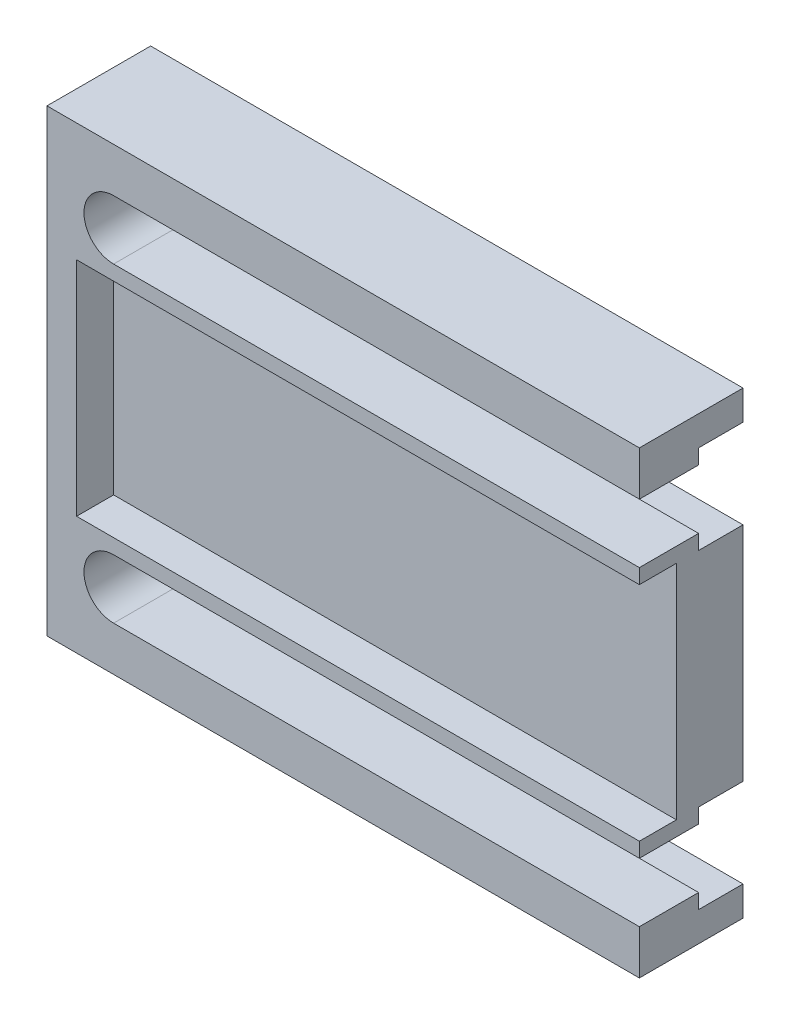
ISO-10303-21;
HEADER;
FILE_DESCRIPTION(('STEP AP214'),'2;1');
FILE_NAME('part.step','',(''),(''),'','','');
FILE_SCHEMA(('AUTOMOTIVE_DESIGN { 1 0 10303 214 1 1 1 1 }'));
ENDSEC;
DATA;
#1=APPLICATION_CONTEXT('core data for automotive mechanical design processes');
#2=APPLICATION_PROTOCOL_DEFINITION('international standard','automotive_design',2000,#1);
#3=PRODUCT_CONTEXT('',#1,'mechanical');
#4=PRODUCT('Part','Part','',(#3));
#5=PRODUCT_RELATED_PRODUCT_CATEGORY('part','',(#4));
#6=PRODUCT_DEFINITION_FORMATION('','',#4);
#7=PRODUCT_DEFINITION_CONTEXT('part definition',#1,'design');
#8=PRODUCT_DEFINITION('design','',#6,#7);
#9=PRODUCT_DEFINITION_SHAPE('','',#8);
#10=(LENGTH_UNIT() NAMED_UNIT(*) SI_UNIT(.MILLI.,.METRE.));
#11=(NAMED_UNIT(*) PLANE_ANGLE_UNIT() SI_UNIT($,.RADIAN.));
#12=(NAMED_UNIT(*) SI_UNIT($,.STERADIAN.) SOLID_ANGLE_UNIT());
#13=UNCERTAINTY_MEASURE_WITH_UNIT(LENGTH_MEASURE(1.E-05),#10,'distance_accuracy_value','');
#14=(GEOMETRIC_REPRESENTATION_CONTEXT(3) GLOBAL_UNCERTAINTY_ASSIGNED_CONTEXT((#13)) GLOBAL_UNIT_ASSIGNED_CONTEXT((#10,
#11,#12)) REPRESENTATION_CONTEXT('',''));
#15=CARTESIAN_POINT('',(0.,0.,0.));
#16=DIRECTION('',(0.,0.,1.));
#17=DIRECTION('',(1.,0.,0.));
#18=AXIS2_PLACEMENT_3D('',#15,#16,#17);
#19=CARTESIAN_POINT('',(0.,0.,7.));
#20=DIRECTION('',(0.,0.,1.));
#21=DIRECTION('',(1.,0.,0.));
#22=AXIS2_PLACEMENT_3D('',#19,#20,#21);
#23=PLANE('',#22);
#24=DIRECTION('',(-1.,0.,0.));
#25=VECTOR('',#24,1.);
#26=CARTESIAN_POINT('',(0.,21.,7.));
#27=LINE('',#26,#25);
#28=CARTESIAN_POINT('',(38.,21.,7.));
#29=VERTEX_POINT('',#28);
#30=CARTESIAN_POINT('',(0.,21.,7.));
#31=VERTEX_POINT('',#30);
#32=EDGE_CURVE('E289',#29,#31,#27,.T.);
#33=ORIENTED_EDGE('',*,*,#32,.F.);
#34=DIRECTION('',(0.,-1.,0.));
#35=VECTOR('',#34,1.);
#36=CARTESIAN_POINT('',(38.,21.,7.));
#37=LINE('',#36,#35);
#38=CARTESIAN_POINT('',(38.,22.,7.));
#39=VERTEX_POINT('',#38);
#40=EDGE_CURVE('E231',#39,#29,#37,.T.);
#41=ORIENTED_EDGE('',*,*,#40,.F.);
#42=DIRECTION('',(-1.,0.,0.));
#43=VECTOR('',#42,1.);
#44=CARTESIAN_POINT('',(0.,22.,7.));
#45=LINE('',#44,#43);
#46=CARTESIAN_POINT('',(2.5,22.,7.));
#47=VERTEX_POINT('',#46);
#48=EDGE_CURVE('E370',#39,#47,#45,.T.);
#49=ORIENTED_EDGE('',*,*,#48,.T.);
#50=CARTESIAN_POINT('',(2.5,24.,7.));
#51=DIRECTION('',(0.,0.,1.));
#52=DIRECTION('',(1.,0.,0.));
#53=AXIS2_PLACEMENT_3D('',#50,#51,#52);
#54=CIRCLE('',#53,2.);
#55=CARTESIAN_POINT('',(2.5,26.,7.));
#56=VERTEX_POINT('',#55);
#57=EDGE_CURVE('E373',#47,#56,#54,.F.);
#58=ORIENTED_EDGE('',*,*,#57,.T.);
#59=DIRECTION('',(-1.,0.,0.));
#60=VECTOR('',#59,1.);
#61=CARTESIAN_POINT('',(0.,26.,7.));
#62=LINE('',#61,#60);
#63=CARTESIAN_POINT('',(38.,26.,7.));
#64=VERTEX_POINT('',#63);
#65=EDGE_CURVE('E376',#64,#56,#62,.T.);
#66=ORIENTED_EDGE('',*,*,#65,.F.);
#67=DIRECTION('',(0.,-1.,0.));
#68=VECTOR('',#67,1.);
#69=CARTESIAN_POINT('',(38.,26.,7.));
#70=LINE('',#69,#68);
#71=CARTESIAN_POINT('',(38.,29.,7.));
#72=VERTEX_POINT('',#71);
#73=EDGE_CURVE('E282',#72,#64,#70,.T.);
#74=ORIENTED_EDGE('',*,*,#73,.F.);
#75=DIRECTION('',(1.,0.,0.));
#76=VECTOR('',#75,1.);
#77=CARTESIAN_POINT('',(0.,29.,7.));
#78=LINE('',#77,#76);
#79=CARTESIAN_POINT('',(-2.,29.,7.));
#80=VERTEX_POINT('',#79);
#81=EDGE_CURVE('E205',#80,#72,#78,.T.);
#82=ORIENTED_EDGE('',*,*,#81,.F.);
#83=DIRECTION('',(0.,1.,0.));
#84=VECTOR('',#83,1.);
#85=CARTESIAN_POINT('',(-2.,0.,7.));
#86=LINE('',#85,#84);
#87=CARTESIAN_POINT('',(-2.,-2.,7.));
#88=VERTEX_POINT('',#87);
#89=EDGE_CURVE('E203',#88,#80,#86,.T.);
#90=ORIENTED_EDGE('',*,*,#89,.F.);
#91=DIRECTION('',(1.,0.,0.));
#92=VECTOR('',#91,1.);
#93=CARTESIAN_POINT('',(0.,-2.,7.));
#94=LINE('',#93,#92);
#95=CARTESIAN_POINT('',(38.,-2.,7.));
#96=VERTEX_POINT('',#95);
#97=EDGE_CURVE('E196',#88,#96,#94,.T.);
#98=ORIENTED_EDGE('',*,*,#97,.T.);
#99=DIRECTION('',(0.,-1.,0.));
#100=VECTOR('',#99,1.);
#101=CARTESIAN_POINT('',(38.,-2.,7.));
#102=LINE('',#101,#100);
#103=CARTESIAN_POINT('',(38.,1.,7.));
#104=VERTEX_POINT('',#103);
#105=EDGE_CURVE('E200',#104,#96,#102,.T.);
#106=ORIENTED_EDGE('',*,*,#105,.F.);
#107=DIRECTION('',(-1.,0.,0.));
#108=VECTOR('',#107,1.);
#109=CARTESIAN_POINT('',(0.,1.,7.));
#110=LINE('',#109,#108);
#111=CARTESIAN_POINT('',(2.5,1.,7.));
#112=VERTEX_POINT('',#111);
#113=EDGE_CURVE('E366',#104,#112,#110,.T.);
#114=ORIENTED_EDGE('',*,*,#113,.T.);
#115=CARTESIAN_POINT('',(2.5,3.,7.));
#116=DIRECTION('',(0.,0.,1.));
#117=DIRECTION('',(1.,0.,0.));
#118=AXIS2_PLACEMENT_3D('',#115,#116,#117);
#119=CIRCLE('',#118,2.);
#120=CARTESIAN_POINT('',(2.5,5.,7.));
#121=VERTEX_POINT('',#120);
#122=EDGE_CURVE('E368',#121,#112,#119,.T.);
#123=ORIENTED_EDGE('',*,*,#122,.F.);
#124=DIRECTION('',(-1.,0.,0.));
#125=VECTOR('',#124,1.);
#126=CARTESIAN_POINT('',(0.,5.,7.));
#127=LINE('',#126,#125);
#128=CARTESIAN_POINT('',(38.,5.,7.));
#129=VERTEX_POINT('',#128);
#130=EDGE_CURVE('E360',#129,#121,#127,.T.);
#131=ORIENTED_EDGE('',*,*,#130,.F.);
#132=DIRECTION('',(0.,-1.,0.));
#133=VECTOR('',#132,1.);
#134=CARTESIAN_POINT('',(38.,5.,7.));
#135=LINE('',#134,#133);
#136=CARTESIAN_POINT('',(38.,6.,7.));
#137=VERTEX_POINT('',#136);
#138=EDGE_CURVE('E243',#137,#129,#135,.T.);
#139=ORIENTED_EDGE('',*,*,#138,.F.);
#140=DIRECTION('',(1.,0.,0.));
#141=VECTOR('',#140,1.);
#142=CARTESIAN_POINT('',(0.,6.,7.));
#143=LINE('',#142,#141);
#144=CARTESIAN_POINT('',(0.,6.,7.));
#145=VERTEX_POINT('',#144);
#146=EDGE_CURVE('E296',#145,#137,#143,.T.);
#147=ORIENTED_EDGE('',*,*,#146,.F.);
#148=DIRECTION('',(0.,-1.,0.));
#149=VECTOR('',#148,1.);
#150=CARTESIAN_POINT('',(0.,21.,7.));
#151=LINE('',#150,#149);
#152=EDGE_CURVE('E50',#31,#145,#151,.T.);
#153=ORIENTED_EDGE('',*,*,#152,.F.);
#154=EDGE_LOOP('',(#33,#41,#49,#58,#66,#74,#82,#90,#98,#106,#114,#123,#131,#139,#147,#153));
#155=FACE_BOUND('',#154,.T.);
#156=ADVANCED_FACE('F35',(#155),#23,.T.);
#157=CARTESIAN_POINT('',(0.,0.,0.));
#158=DIRECTION('',(0.,0.,1.));
#159=DIRECTION('',(1.,0.,0.));
#160=AXIS2_PLACEMENT_3D('',#157,#158,#159);
#161=PLANE('',#160);
#162=DIRECTION('',(1.,0.,0.));
#163=VECTOR('',#162,1.);
#164=CARTESIAN_POINT('',(0.,29.,0.));
#165=LINE('',#164,#163);
#166=CARTESIAN_POINT('',(-2.,29.,0.));
#167=VERTEX_POINT('',#166);
#168=CARTESIAN_POINT('',(38.,29.,0.));
#169=VERTEX_POINT('',#168);
#170=EDGE_CURVE('E381',#167,#169,#165,.T.);
#171=ORIENTED_EDGE('',*,*,#170,.T.);
#172=DIRECTION('',(0.,1.,0.));
#173=VECTOR('',#172,1.);
#174=CARTESIAN_POINT('',(38.,29.,0.));
#175=LINE('',#174,#173);
#176=CARTESIAN_POINT('',(38.,27.,0.));
#177=VERTEX_POINT('',#176);
#178=EDGE_CURVE('E276',#177,#169,#175,.T.);
#179=ORIENTED_EDGE('',*,*,#178,.F.);
#180=DIRECTION('',(1.,0.,0.));
#181=VECTOR('',#180,1.);
#182=CARTESIAN_POINT('',(0.,27.,0.));
#183=LINE('',#182,#181);
#184=CARTESIAN_POINT('',(0.,27.,0.));
#185=VERTEX_POINT('',#184);
#186=EDGE_CURVE('E318',#185,#177,#183,.T.);
#187=ORIENTED_EDGE('',*,*,#186,.F.);
#188=DIRECTION('',(0.,-1.,0.));
#189=VECTOR('',#188,1.);
#190=CARTESIAN_POINT('',(0.,0.,0.));
#191=LINE('',#190,#189);
#192=CARTESIAN_POINT('',(0.,21.,0.));
#193=VERTEX_POINT('',#192);
#194=EDGE_CURVE('E320',#185,#193,#191,.T.);
#195=ORIENTED_EDGE('',*,*,#194,.T.);
#196=DIRECTION('',(-1.,0.,0.));
#197=VECTOR('',#196,1.);
#198=CARTESIAN_POINT('',(0.,21.,0.));
#199=LINE('',#198,#197);
#200=CARTESIAN_POINT('',(38.,21.,0.));
#201=VERTEX_POINT('',#200);
#202=EDGE_CURVE('E307',#201,#193,#199,.T.);
#203=ORIENTED_EDGE('',*,*,#202,.F.);
#204=DIRECTION('',(0.,1.,0.));
#205=VECTOR('',#204,1.);
#206=CARTESIAN_POINT('',(38.,21.,0.));
#207=LINE('',#206,#205);
#208=CARTESIAN_POINT('',(38.,6.,0.));
#209=VERTEX_POINT('',#208);
#210=EDGE_CURVE('E255',#209,#201,#207,.T.);
#211=ORIENTED_EDGE('',*,*,#210,.F.);
#212=DIRECTION('',(1.,0.,0.));
#213=VECTOR('',#212,1.);
#214=CARTESIAN_POINT('',(0.,6.,0.));
#215=LINE('',#214,#213);
#216=CARTESIAN_POINT('',(0.,6.,0.));
#217=VERTEX_POINT('',#216);
#218=EDGE_CURVE('E302',#217,#209,#215,.T.);
#219=ORIENTED_EDGE('',*,*,#218,.F.);
#220=DIRECTION('',(0.,1.,0.));
#221=VECTOR('',#220,1.);
#222=CARTESIAN_POINT('',(0.,0.,0.));
#223=LINE('',#222,#221);
#224=CARTESIAN_POINT('',(0.,0.,0.));
#225=VERTEX_POINT('',#224);
#226=EDGE_CURVE('E347',#225,#217,#223,.T.);
#227=ORIENTED_EDGE('',*,*,#226,.F.);
#228=DIRECTION('',(1.,0.,0.));
#229=VECTOR('',#228,1.);
#230=CARTESIAN_POINT('',(0.,0.,0.));
#231=LINE('',#230,#229);
#232=CARTESIAN_POINT('',(38.,0.,0.));
#233=VERTEX_POINT('',#232);
#234=EDGE_CURVE('E333',#225,#233,#231,.T.);
#235=ORIENTED_EDGE('',*,*,#234,.T.);
#236=DIRECTION('',(0.,1.,0.));
#237=VECTOR('',#236,1.);
#238=CARTESIAN_POINT('',(38.,0.,0.));
#239=LINE('',#238,#237);
#240=CARTESIAN_POINT('',(38.,-2.,0.));
#241=VERTEX_POINT('',#240);
#242=EDGE_CURVE('E215',#241,#233,#239,.T.);
#243=ORIENTED_EDGE('',*,*,#242,.F.);
#244=DIRECTION('',(1.,0.,0.));
#245=VECTOR('',#244,1.);
#246=CARTESIAN_POINT('',(0.,-2.,0.));
#247=LINE('',#246,#245);
#248=CARTESIAN_POINT('',(-2.,-2.,0.));
#249=VERTEX_POINT('',#248);
#250=EDGE_CURVE('E211',#249,#241,#247,.T.);
#251=ORIENTED_EDGE('',*,*,#250,.F.);
#252=DIRECTION('',(0.,1.,0.));
#253=VECTOR('',#252,1.);
#254=CARTESIAN_POINT('',(-2.,0.,0.));
#255=LINE('',#254,#253);
#256=EDGE_CURVE('E206',#249,#167,#255,.T.);
#257=ORIENTED_EDGE('',*,*,#256,.T.);
#258=EDGE_LOOP('',(#171,#179,#187,#195,#203,#211,#219,#227,#235,#243,#251,#257));
#259=FACE_BOUND('',#258,.T.);
#260=ADVANCED_FACE('F387',(#259),#161,.F.);
#261=CARTESIAN_POINT('',(0.,-2.,7.));
#262=DIRECTION('',(0.,1.,0.));
#263=DIRECTION('',(-1.,0.,0.));
#264=AXIS2_PLACEMENT_3D('',#261,#262,#263);
#265=PLANE('',#264);
#266=ORIENTED_EDGE('',*,*,#250,.T.);
#267=DIRECTION('',(0.,0.,-1.));
#268=VECTOR('',#267,1.);
#269=CARTESIAN_POINT('',(38.,-2.,0.));
#270=LINE('',#269,#268);
#271=EDGE_CURVE('E209',#96,#241,#270,.T.);
#272=ORIENTED_EDGE('',*,*,#271,.F.);
#273=ORIENTED_EDGE('',*,*,#97,.F.);
#274=DIRECTION('',(0.,0.,-1.));
#275=VECTOR('',#274,1.);
#276=CARTESIAN_POINT('',(-2.,-2.,7.));
#277=LINE('',#276,#275);
#278=EDGE_CURVE('E43',#88,#249,#277,.T.);
#279=ORIENTED_EDGE('',*,*,#278,.T.);
#280=EDGE_LOOP('',(#266,#272,#273,#279));
#281=FACE_BOUND('',#280,.T.);
#282=ADVANCED_FACE('F37',(#281),#265,.F.);
#283=CARTESIAN_POINT('',(0.,29.,7.));
#284=DIRECTION('',(0.,1.,0.));
#285=DIRECTION('',(0.,0.,1.));
#286=AXIS2_PLACEMENT_3D('',#283,#284,#285);
#287=PLANE('',#286);
#288=ORIENTED_EDGE('',*,*,#170,.F.);
#289=DIRECTION('',(0.,0.,-1.));
#290=VECTOR('',#289,1.);
#291=CARTESIAN_POINT('',(-2.,29.,7.));
#292=LINE('',#291,#290);
#293=EDGE_CURVE('E11',#80,#167,#292,.T.);
#294=ORIENTED_EDGE('',*,*,#293,.F.);
#295=ORIENTED_EDGE('',*,*,#81,.T.);
#296=DIRECTION('',(0.,0.,1.));
#297=VECTOR('',#296,1.);
#298=CARTESIAN_POINT('',(38.,29.,7.));
#299=LINE('',#298,#297);
#300=EDGE_CURVE('E279',#169,#72,#299,.T.);
#301=ORIENTED_EDGE('',*,*,#300,.F.);
#302=EDGE_LOOP('',(#288,#294,#295,#301));
#303=FACE_BOUND('',#302,.T.);
#304=ADVANCED_FACE('F392',(#303),#287,.T.);
#305=CARTESIAN_POINT('',(-2.,0.,7.));
#306=DIRECTION('',(-1.,0.,0.));
#307=DIRECTION('',(0.,0.,1.));
#308=AXIS2_PLACEMENT_3D('',#305,#306,#307);
#309=PLANE('',#308);
#310=ORIENTED_EDGE('',*,*,#256,.F.);
#311=ORIENTED_EDGE('',*,*,#278,.F.);
#312=ORIENTED_EDGE('',*,*,#89,.T.);
#313=ORIENTED_EDGE('',*,*,#293,.T.);
#314=EDGE_LOOP('',(#310,#311,#312,#313));
#315=FACE_BOUND('',#314,.T.);
#316=ADVANCED_FACE('F388',(#315),#309,.T.);
#317=CARTESIAN_POINT('',(2.5,3.,14.));
#318=DIRECTION('',(0.,0.,-1.));
#319=DIRECTION('',(-1.,0.,0.));
#320=AXIS2_PLACEMENT_3D('',#317,#318,#319);
#321=CYLINDRICAL_SURFACE('',#320,2.);
#322=DIRECTION('',(0.,0.,-1.));
#323=VECTOR('',#322,1.);
#324=CARTESIAN_POINT('',(2.5,1.,14.));
#325=LINE('',#324,#323);
#326=CARTESIAN_POINT('',(2.5,1.,3.));
#327=VERTEX_POINT('',#326);
#328=EDGE_CURVE('E357',#112,#327,#325,.T.);
#329=ORIENTED_EDGE('',*,*,#328,.T.);
#330=CARTESIAN_POINT('',(2.5,3.,3.));
#331=DIRECTION('',(0.,0.,1.));
#332=DIRECTION('',(1.,0.,0.));
#333=AXIS2_PLACEMENT_3D('',#330,#331,#332);
#334=CIRCLE('',#333,2.);
#335=CARTESIAN_POINT('',(2.5,5.,3.));
#336=VERTEX_POINT('',#335);
#337=EDGE_CURVE('E342',#327,#336,#334,.F.);
#338=ORIENTED_EDGE('',*,*,#337,.T.);
#339=DIRECTION('',(0.,0.,-1.));
#340=VECTOR('',#339,1.);
#341=CARTESIAN_POINT('',(2.5,5.,14.));
#342=LINE('',#341,#340);
#343=EDGE_CURVE('E329',#121,#336,#342,.T.);
#344=ORIENTED_EDGE('',*,*,#343,.F.);
#345=ORIENTED_EDGE('',*,*,#122,.T.);
#346=EDGE_LOOP('',(#329,#338,#344,#345));
#347=FACE_BOUND('',#346,.T.);
#348=ADVANCED_FACE('F442',(#347),#321,.F.);
#349=CARTESIAN_POINT('',(0.,1.,14.));
#350=DIRECTION('',(0.,1.,0.));
#351=DIRECTION('',(0.,0.,1.));
#352=AXIS2_PLACEMENT_3D('',#349,#350,#351);
#353=PLANE('',#352);
#354=DIRECTION('',(1.,0.,0.));
#355=VECTOR('',#354,1.);
#356=CARTESIAN_POINT('',(0.,1.,3.));
#357=LINE('',#356,#355);
#358=CARTESIAN_POINT('',(38.,1.,3.));
#359=VERTEX_POINT('',#358);
#360=EDGE_CURVE('E340',#327,#359,#357,.T.);
#361=ORIENTED_EDGE('',*,*,#360,.F.);
#362=ORIENTED_EDGE('',*,*,#328,.F.);
#363=ORIENTED_EDGE('',*,*,#113,.F.);
#364=DIRECTION('',(0.,0.,1.));
#365=VECTOR('',#364,1.);
#366=CARTESIAN_POINT('',(38.,1.,7.));
#367=LINE('',#366,#365);
#368=EDGE_CURVE('E221',#359,#104,#367,.T.);
#369=ORIENTED_EDGE('',*,*,#368,.F.);
#370=EDGE_LOOP('',(#361,#362,#363,#369));
#371=FACE_BOUND('',#370,.T.);
#372=ADVANCED_FACE('F450',(#371),#353,.T.);
#373=CARTESIAN_POINT('',(0.,5.,14.));
#374=DIRECTION('',(0.,1.,0.));
#375=DIRECTION('',(0.,0.,1.));
#376=AXIS2_PLACEMENT_3D('',#373,#374,#375);
#377=PLANE('',#376);
#378=ORIENTED_EDGE('',*,*,#343,.T.);
#379=DIRECTION('',(1.,0.,0.));
#380=VECTOR('',#379,1.);
#381=CARTESIAN_POINT('',(0.,5.,3.));
#382=LINE('',#381,#380);
#383=CARTESIAN_POINT('',(38.,5.,3.));
#384=VERTEX_POINT('',#383);
#385=EDGE_CURVE('E330',#336,#384,#382,.T.);
#386=ORIENTED_EDGE('',*,*,#385,.T.);
#387=DIRECTION('',(0.,0.,-1.));
#388=VECTOR('',#387,1.);
#389=CARTESIAN_POINT('',(38.,5.,3.));
#390=LINE('',#389,#388);
#391=EDGE_CURVE('E246',#129,#384,#390,.T.);
#392=ORIENTED_EDGE('',*,*,#391,.F.);
#393=ORIENTED_EDGE('',*,*,#130,.T.);
#394=EDGE_LOOP('',(#378,#386,#392,#393));
#395=FACE_BOUND('',#394,.T.);
#396=ADVANCED_FACE('F440',(#395),#377,.F.);
#397=CARTESIAN_POINT('',(0.,26.,14.));
#398=DIRECTION('',(0.,1.,0.));
#399=DIRECTION('',(0.,0.,1.));
#400=AXIS2_PLACEMENT_3D('',#397,#398,#399);
#401=PLANE('',#400);
#402=DIRECTION('',(0.,0.,-1.));
#403=VECTOR('',#402,1.);
#404=CARTESIAN_POINT('',(2.5,26.,14.));
#405=LINE('',#404,#403);
#406=CARTESIAN_POINT('',(2.5,26.,3.));
#407=VERTEX_POINT('',#406);
#408=EDGE_CURVE('E356',#56,#407,#405,.T.);
#409=ORIENTED_EDGE('',*,*,#408,.T.);
#410=DIRECTION('',(1.,0.,0.));
#411=VECTOR('',#410,1.);
#412=CARTESIAN_POINT('',(0.,26.,3.));
#413=LINE('',#412,#411);
#414=CARTESIAN_POINT('',(38.,26.,3.));
#415=VERTEX_POINT('',#414);
#416=EDGE_CURVE('E304',#407,#415,#413,.T.);
#417=ORIENTED_EDGE('',*,*,#416,.T.);
#418=DIRECTION('',(0.,0.,-1.));
#419=VECTOR('',#418,1.);
#420=CARTESIAN_POINT('',(38.,26.,3.));
#421=LINE('',#420,#419);
#422=EDGE_CURVE('E267',#64,#415,#421,.T.);
#423=ORIENTED_EDGE('',*,*,#422,.F.);
#424=ORIENTED_EDGE('',*,*,#65,.T.);
#425=EDGE_LOOP('',(#409,#417,#423,#424));
#426=FACE_BOUND('',#425,.T.);
#427=ADVANCED_FACE('F457',(#426),#401,.F.);
#428=CARTESIAN_POINT('',(2.5,24.,14.));
#429=DIRECTION('',(0.,0.,-1.));
#430=DIRECTION('',(-1.,0.,0.));
#431=AXIS2_PLACEMENT_3D('',#428,#429,#430);
#432=CYLINDRICAL_SURFACE('',#431,2.);
#433=CARTESIAN_POINT('',(2.5,24.,3.));
#434=DIRECTION('',(0.,0.,1.));
#435=DIRECTION('',(1.,0.,0.));
#436=AXIS2_PLACEMENT_3D('',#433,#434,#435);
#437=CIRCLE('',#436,2.);
#438=CARTESIAN_POINT('',(2.5,22.,3.));
#439=VERTEX_POINT('',#438);
#440=EDGE_CURVE('E58',#407,#439,#437,.T.);
#441=ORIENTED_EDGE('',*,*,#440,.F.);
#442=ORIENTED_EDGE('',*,*,#408,.F.);
#443=ORIENTED_EDGE('',*,*,#57,.F.);
#444=DIRECTION('',(0.,0.,-1.));
#445=VECTOR('',#444,1.);
#446=CARTESIAN_POINT('',(2.5,22.,14.));
#447=LINE('',#446,#445);
#448=EDGE_CURVE('E353',#47,#439,#447,.T.);
#449=ORIENTED_EDGE('',*,*,#448,.T.);
#450=EDGE_LOOP('',(#441,#442,#443,#449));
#451=FACE_BOUND('',#450,.T.);
#452=ADVANCED_FACE('F421',(#451),#432,.F.);
#453=CARTESIAN_POINT('',(0.,22.,14.));
#454=DIRECTION('',(0.,1.,0.));
#455=DIRECTION('',(0.,0.,1.));
#456=AXIS2_PLACEMENT_3D('',#453,#454,#455);
#457=PLANE('',#456);
#458=DIRECTION('',(1.,0.,0.));
#459=VECTOR('',#458,1.);
#460=CARTESIAN_POINT('',(0.,22.,3.));
#461=LINE('',#460,#459);
#462=CARTESIAN_POINT('',(38.,22.,3.));
#463=VERTEX_POINT('',#462);
#464=EDGE_CURVE('E314',#439,#463,#461,.T.);
#465=ORIENTED_EDGE('',*,*,#464,.F.);
#466=ORIENTED_EDGE('',*,*,#448,.F.);
#467=ORIENTED_EDGE('',*,*,#48,.F.);
#468=DIRECTION('',(0.,0.,1.));
#469=VECTOR('',#468,1.);
#470=CARTESIAN_POINT('',(38.,22.,7.));
#471=LINE('',#470,#469);
#472=EDGE_CURVE('E264',#463,#39,#471,.T.);
#473=ORIENTED_EDGE('',*,*,#472,.F.);
#474=EDGE_LOOP('',(#465,#466,#467,#473));
#475=FACE_BOUND('',#474,.T.);
#476=ADVANCED_FACE('F419',(#475),#457,.T.);
#477=CARTESIAN_POINT('',(0.,27.,3.));
#478=DIRECTION('',(0.,1.,0.));
#479=DIRECTION('',(0.,0.,1.));
#480=AXIS2_PLACEMENT_3D('',#477,#478,#479);
#481=PLANE('',#480);
#482=ORIENTED_EDGE('',*,*,#186,.T.);
#483=DIRECTION('',(0.,0.,-1.));
#484=VECTOR('',#483,1.);
#485=CARTESIAN_POINT('',(38.,27.,0.));
#486=LINE('',#485,#484);
#487=CARTESIAN_POINT('',(38.,27.,3.));
#488=VERTEX_POINT('',#487);
#489=EDGE_CURVE('E273',#488,#177,#486,.T.);
#490=ORIENTED_EDGE('',*,*,#489,.F.);
#491=DIRECTION('',(1.,0.,0.));
#492=VECTOR('',#491,1.);
#493=CARTESIAN_POINT('',(0.,27.,3.));
#494=LINE('',#493,#492);
#495=CARTESIAN_POINT('',(0.,27.,3.));
#496=VERTEX_POINT('',#495);
#497=EDGE_CURVE('E306',#496,#488,#494,.T.);
#498=ORIENTED_EDGE('',*,*,#497,.F.);
#499=DIRECTION('',(0.,0.,-1.));
#500=VECTOR('',#499,1.);
#501=CARTESIAN_POINT('',(0.,27.,3.));
#502=LINE('',#501,#500);
#503=EDGE_CURVE('E327',#496,#185,#502,.T.);
#504=ORIENTED_EDGE('',*,*,#503,.T.);
#505=EDGE_LOOP('',(#482,#490,#498,#504));
#506=FACE_BOUND('',#505,.T.);
#507=ADVANCED_FACE('F402',(#506),#481,.F.);
#508=CARTESIAN_POINT('',(0.,0.,3.));
#509=DIRECTION('',(1.,0.,0.));
#510=DIRECTION('',(0.,1.,0.));
#511=AXIS2_PLACEMENT_3D('',#508,#509,#510);
#512=PLANE('',#511);
#513=ORIENTED_EDGE('',*,*,#194,.F.);
#514=ORIENTED_EDGE('',*,*,#503,.F.);
#515=DIRECTION('',(0.,-1.,0.));
#516=VECTOR('',#515,1.);
#517=CARTESIAN_POINT('',(0.,0.,3.));
#518=LINE('',#517,#516);
#519=CARTESIAN_POINT('',(0.,21.,3.));
#520=VERTEX_POINT('',#519);
#521=EDGE_CURVE('E309',#496,#520,#518,.T.);
#522=ORIENTED_EDGE('',*,*,#521,.T.);
#523=DIRECTION('',(0.,0.,-1.));
#524=VECTOR('',#523,1.);
#525=CARTESIAN_POINT('',(0.,21.,3.));
#526=LINE('',#525,#524);
#527=EDGE_CURVE('E317',#520,#193,#526,.T.);
#528=ORIENTED_EDGE('',*,*,#527,.T.);
#529=EDGE_LOOP('',(#513,#514,#522,#528));
#530=FACE_BOUND('',#529,.T.);
#531=ADVANCED_FACE('F406',(#530),#512,.T.);
#532=CARTESIAN_POINT('',(0.,21.,3.));
#533=DIRECTION('',(0.,-1.,0.));
#534=DIRECTION('',(1.,0.,0.));
#535=AXIS2_PLACEMENT_3D('',#532,#533,#534);
#536=PLANE('',#535);
#537=ORIENTED_EDGE('',*,*,#202,.T.);
#538=ORIENTED_EDGE('',*,*,#527,.F.);
#539=DIRECTION('',(-1.,0.,0.));
#540=VECTOR('',#539,1.);
#541=CARTESIAN_POINT('',(0.,21.,3.));
#542=LINE('',#541,#540);
#543=CARTESIAN_POINT('',(38.,21.,3.));
#544=VERTEX_POINT('',#543);
#545=EDGE_CURVE('E311',#544,#520,#542,.T.);
#546=ORIENTED_EDGE('',*,*,#545,.F.);
#547=DIRECTION('',(0.,0.,1.));
#548=VECTOR('',#547,1.);
#549=CARTESIAN_POINT('',(38.,21.,3.));
#550=LINE('',#549,#548);
#551=EDGE_CURVE('E258',#201,#544,#550,.T.);
#552=ORIENTED_EDGE('',*,*,#551,.F.);
#553=EDGE_LOOP('',(#537,#538,#546,#552));
#554=FACE_BOUND('',#553,.T.);
#555=ADVANCED_FACE('F411',(#554),#536,.F.);
#556=CARTESIAN_POINT('',(0.,0.,3.));
#557=DIRECTION('',(0.,0.,1.));
#558=DIRECTION('',(1.,0.,0.));
#559=AXIS2_PLACEMENT_3D('',#556,#557,#558);
#560=PLANE('',#559);
#561=ORIENTED_EDGE('',*,*,#416,.F.);
#562=ORIENTED_EDGE('',*,*,#440,.T.);
#563=ORIENTED_EDGE('',*,*,#464,.T.);
#564=DIRECTION('',(0.,1.,0.));
#565=VECTOR('',#564,1.);
#566=CARTESIAN_POINT('',(38.,22.,3.));
#567=LINE('',#566,#565);
#568=EDGE_CURVE('E261',#544,#463,#567,.T.);
#569=ORIENTED_EDGE('',*,*,#568,.F.);
#570=ORIENTED_EDGE('',*,*,#545,.T.);
#571=ORIENTED_EDGE('',*,*,#521,.F.);
#572=ORIENTED_EDGE('',*,*,#497,.T.);
#573=DIRECTION('',(0.,1.,0.));
#574=VECTOR('',#573,1.);
#575=CARTESIAN_POINT('',(38.,27.,3.));
#576=LINE('',#575,#574);
#577=EDGE_CURVE('E270',#415,#488,#576,.T.);
#578=ORIENTED_EDGE('',*,*,#577,.F.);
#579=EDGE_LOOP('',(#561,#562,#563,#569,#570,#571,#572,#578));
#580=FACE_BOUND('',#579,.T.);
#581=ADVANCED_FACE('F416',(#580),#560,.F.);
#582=CARTESIAN_POINT('',(0.,6.,3.));
#583=DIRECTION('',(0.,1.,0.));
#584=DIRECTION('',(0.,0.,1.));
#585=AXIS2_PLACEMENT_3D('',#582,#583,#584);
#586=PLANE('',#585);
#587=ORIENTED_EDGE('',*,*,#218,.T.);
#588=DIRECTION('',(0.,0.,-1.));
#589=VECTOR('',#588,1.);
#590=CARTESIAN_POINT('',(38.,6.,0.));
#591=LINE('',#590,#589);
#592=CARTESIAN_POINT('',(38.,6.,3.));
#593=VERTEX_POINT('',#592);
#594=EDGE_CURVE('E252',#593,#209,#591,.T.);
#595=ORIENTED_EDGE('',*,*,#594,.F.);
#596=DIRECTION('',(1.,0.,0.));
#597=VECTOR('',#596,1.);
#598=CARTESIAN_POINT('',(0.,6.,3.));
#599=LINE('',#598,#597);
#600=CARTESIAN_POINT('',(0.,6.,3.));
#601=VERTEX_POINT('',#600);
#602=EDGE_CURVE('E332',#601,#593,#599,.T.);
#603=ORIENTED_EDGE('',*,*,#602,.F.);
#604=DIRECTION('',(0.,0.,-1.));
#605=VECTOR('',#604,1.);
#606=CARTESIAN_POINT('',(0.,6.,3.));
#607=LINE('',#606,#605);
#608=EDGE_CURVE('E321',#601,#217,#607,.T.);
#609=ORIENTED_EDGE('',*,*,#608,.T.);
#610=EDGE_LOOP('',(#587,#595,#603,#609));
#611=FACE_BOUND('',#610,.T.);
#612=ADVANCED_FACE('F510',(#611),#586,.F.);
#613=CARTESIAN_POINT('',(0.,0.,3.));
#614=DIRECTION('',(-1.,0.,0.));
#615=DIRECTION('',(0.,0.,1.));
#616=AXIS2_PLACEMENT_3D('',#613,#614,#615);
#617=PLANE('',#616);
#618=ORIENTED_EDGE('',*,*,#226,.T.);
#619=ORIENTED_EDGE('',*,*,#608,.F.);
#620=DIRECTION('',(0.,1.,0.));
#621=VECTOR('',#620,1.);
#622=CARTESIAN_POINT('',(0.,0.,3.));
#623=LINE('',#622,#621);
#624=CARTESIAN_POINT('',(0.,0.,3.));
#625=VERTEX_POINT('',#624);
#626=EDGE_CURVE('E335',#625,#601,#623,.T.);
#627=ORIENTED_EDGE('',*,*,#626,.F.);
#628=DIRECTION('',(0.,0.,-1.));
#629=VECTOR('',#628,1.);
#630=CARTESIAN_POINT('',(0.,0.,3.));
#631=LINE('',#630,#629);
#632=EDGE_CURVE('E345',#625,#225,#631,.T.);
#633=ORIENTED_EDGE('',*,*,#632,.T.);
#634=EDGE_LOOP('',(#618,#619,#627,#633));
#635=FACE_BOUND('',#634,.T.);
#636=ADVANCED_FACE('F504',(#635),#617,.F.);
#637=CARTESIAN_POINT('',(0.,0.,3.));
#638=DIRECTION('',(0.,1.,0.));
#639=DIRECTION('',(0.,0.,1.));
#640=AXIS2_PLACEMENT_3D('',#637,#638,#639);
#641=PLANE('',#640);
#642=ORIENTED_EDGE('',*,*,#234,.F.);
#643=ORIENTED_EDGE('',*,*,#632,.F.);
#644=DIRECTION('',(1.,0.,0.));
#645=VECTOR('',#644,1.);
#646=CARTESIAN_POINT('',(0.,0.,3.));
#647=LINE('',#646,#645);
#648=CARTESIAN_POINT('',(38.,0.,3.));
#649=VERTEX_POINT('',#648);
#650=EDGE_CURVE('E338',#625,#649,#647,.T.);
#651=ORIENTED_EDGE('',*,*,#650,.T.);
#652=DIRECTION('',(0.,0.,1.));
#653=VECTOR('',#652,1.);
#654=CARTESIAN_POINT('',(38.,0.,3.));
#655=LINE('',#654,#653);
#656=EDGE_CURVE('E225',#233,#649,#655,.T.);
#657=ORIENTED_EDGE('',*,*,#656,.F.);
#658=EDGE_LOOP('',(#642,#643,#651,#657));
#659=FACE_BOUND('',#658,.T.);
#660=ADVANCED_FACE('F509',(#659),#641,.T.);
#661=CARTESIAN_POINT('',(0.,0.,3.));
#662=DIRECTION('',(0.,0.,1.));
#663=DIRECTION('',(1.,0.,0.));
#664=AXIS2_PLACEMENT_3D('',#661,#662,#663);
#665=PLANE('',#664);
#666=ORIENTED_EDGE('',*,*,#385,.F.);
#667=ORIENTED_EDGE('',*,*,#337,.F.);
#668=ORIENTED_EDGE('',*,*,#360,.T.);
#669=DIRECTION('',(0.,1.,0.));
#670=VECTOR('',#669,1.);
#671=CARTESIAN_POINT('',(38.,1.,3.));
#672=LINE('',#671,#670);
#673=EDGE_CURVE('E228',#649,#359,#672,.T.);
#674=ORIENTED_EDGE('',*,*,#673,.F.);
#675=ORIENTED_EDGE('',*,*,#650,.F.);
#676=ORIENTED_EDGE('',*,*,#626,.T.);
#677=ORIENTED_EDGE('',*,*,#602,.T.);
#678=DIRECTION('',(0.,1.,0.));
#679=VECTOR('',#678,1.);
#680=CARTESIAN_POINT('',(38.,6.,3.));
#681=LINE('',#680,#679);
#682=EDGE_CURVE('E249',#384,#593,#681,.T.);
#683=ORIENTED_EDGE('',*,*,#682,.F.);
#684=EDGE_LOOP('',(#666,#667,#668,#674,#675,#676,#677,#683));
#685=FACE_BOUND('',#684,.T.);
#686=ADVANCED_FACE('F446',(#685),#665,.F.);
#687=CARTESIAN_POINT('',(0.,21.,4.5));
#688=DIRECTION('',(-1.,0.,0.));
#689=DIRECTION('',(0.,0.,1.));
#690=AXIS2_PLACEMENT_3D('',#687,#688,#689);
#691=PLANE('',#690);
#692=ORIENTED_EDGE('',*,*,#152,.T.);
#693=DIRECTION('',(0.,0.,1.));
#694=VECTOR('',#693,1.);
#695=CARTESIAN_POINT('',(0.,6.,4.5));
#696=LINE('',#695,#694);
#697=CARTESIAN_POINT('',(0.,6.,4.5));
#698=VERTEX_POINT('',#697);
#699=EDGE_CURVE('E294',#698,#145,#696,.T.);
#700=ORIENTED_EDGE('',*,*,#699,.F.);
#701=DIRECTION('',(0.,-1.,0.));
#702=VECTOR('',#701,1.);
#703=CARTESIAN_POINT('',(0.,21.,4.5));
#704=LINE('',#703,#702);
#705=CARTESIAN_POINT('',(0.,21.,4.5));
#706=VERTEX_POINT('',#705);
#707=EDGE_CURVE('E285',#706,#698,#704,.T.);
#708=ORIENTED_EDGE('',*,*,#707,.F.);
#709=DIRECTION('',(0.,0.,1.));
#710=VECTOR('',#709,1.);
#711=CARTESIAN_POINT('',(0.,21.,4.5));
#712=LINE('',#711,#710);
#713=EDGE_CURVE('E300',#706,#31,#712,.T.);
#714=ORIENTED_EDGE('',*,*,#713,.T.);
#715=EDGE_LOOP('',(#692,#700,#708,#714));
#716=FACE_BOUND('',#715,.T.);
#717=ADVANCED_FACE('F490',(#716),#691,.F.);
#718=CARTESIAN_POINT('',(0.,21.,4.5));
#719=DIRECTION('',(0.,1.,0.));
#720=DIRECTION('',(0.,0.,1.));
#721=AXIS2_PLACEMENT_3D('',#718,#719,#720);
#722=PLANE('',#721);
#723=ORIENTED_EDGE('',*,*,#32,.T.);
#724=ORIENTED_EDGE('',*,*,#713,.F.);
#725=DIRECTION('',(-1.,0.,0.));
#726=VECTOR('',#725,1.);
#727=CARTESIAN_POINT('',(0.,21.,4.5));
#728=LINE('',#727,#726);
#729=CARTESIAN_POINT('',(38.,21.,4.5));
#730=VERTEX_POINT('',#729);
#731=EDGE_CURVE('E291',#730,#706,#728,.T.);
#732=ORIENTED_EDGE('',*,*,#731,.F.);
#733=DIRECTION('',(0.,0.,-1.));
#734=VECTOR('',#733,1.);
#735=CARTESIAN_POINT('',(38.,21.,4.5));
#736=LINE('',#735,#734);
#737=EDGE_CURVE('E234',#29,#730,#736,.T.);
#738=ORIENTED_EDGE('',*,*,#737,.F.);
#739=EDGE_LOOP('',(#723,#724,#732,#738));
#740=FACE_BOUND('',#739,.T.);
#741=ADVANCED_FACE('F495',(#740),#722,.F.);
#742=CARTESIAN_POINT('',(0.,6.,4.5));
#743=DIRECTION('',(0.,-1.,0.));
#744=DIRECTION('',(0.,0.,-1.));
#745=AXIS2_PLACEMENT_3D('',#742,#743,#744);
#746=PLANE('',#745);
#747=ORIENTED_EDGE('',*,*,#146,.T.);
#748=DIRECTION('',(0.,0.,1.));
#749=VECTOR('',#748,1.);
#750=CARTESIAN_POINT('',(38.,6.,7.));
#751=LINE('',#750,#749);
#752=CARTESIAN_POINT('',(38.,6.,4.5));
#753=VERTEX_POINT('',#752);
#754=EDGE_CURVE('E240',#753,#137,#751,.T.);
#755=ORIENTED_EDGE('',*,*,#754,.F.);
#756=DIRECTION('',(1.,0.,0.));
#757=VECTOR('',#756,1.);
#758=CARTESIAN_POINT('',(0.,6.,4.5));
#759=LINE('',#758,#757);
#760=EDGE_CURVE('E288',#698,#753,#759,.T.);
#761=ORIENTED_EDGE('',*,*,#760,.F.);
#762=ORIENTED_EDGE('',*,*,#699,.T.);
#763=EDGE_LOOP('',(#747,#755,#761,#762));
#764=FACE_BOUND('',#763,.T.);
#765=ADVANCED_FACE('F433',(#764),#746,.F.);
#766=CARTESIAN_POINT('',(0.,0.,4.5));
#767=DIRECTION('',(0.,0.,1.));
#768=DIRECTION('',(1.,0.,0.));
#769=AXIS2_PLACEMENT_3D('',#766,#767,#768);
#770=PLANE('',#769);
#771=ORIENTED_EDGE('',*,*,#707,.T.);
#772=ORIENTED_EDGE('',*,*,#760,.T.);
#773=DIRECTION('',(0.,-1.,0.));
#774=VECTOR('',#773,1.);
#775=CARTESIAN_POINT('',(38.,6.,4.5));
#776=LINE('',#775,#774);
#777=EDGE_CURVE('E237',#730,#753,#776,.T.);
#778=ORIENTED_EDGE('',*,*,#777,.F.);
#779=ORIENTED_EDGE('',*,*,#731,.T.);
#780=EDGE_LOOP('',(#771,#772,#778,#779));
#781=FACE_BOUND('',#780,.T.);
#782=ADVANCED_FACE('F429',(#781),#770,.T.);
#783=CARTESIAN_POINT('',(38.,0.,0.));
#784=DIRECTION('',(-1.,0.,0.));
#785=DIRECTION('',(0.,0.,1.));
#786=AXIS2_PLACEMENT_3D('',#783,#784,#785);
#787=PLANE('',#786);
#788=ORIENTED_EDGE('',*,*,#422,.T.);
#789=ORIENTED_EDGE('',*,*,#577,.T.);
#790=ORIENTED_EDGE('',*,*,#489,.T.);
#791=ORIENTED_EDGE('',*,*,#178,.T.);
#792=ORIENTED_EDGE('',*,*,#300,.T.);
#793=ORIENTED_EDGE('',*,*,#73,.T.);
#794=EDGE_LOOP('',(#788,#789,#790,#791,#792,#793));
#795=FACE_BOUND('',#794,.T.);
#796=ADVANCED_FACE('F396',(#795),#787,.F.);
#797=CARTESIAN_POINT('',(38.,0.,0.));
#798=DIRECTION('',(-1.,0.,0.));
#799=DIRECTION('',(0.,0.,1.));
#800=AXIS2_PLACEMENT_3D('',#797,#798,#799);
#801=PLANE('',#800);
#802=ORIENTED_EDGE('',*,*,#40,.T.);
#803=ORIENTED_EDGE('',*,*,#737,.T.);
#804=ORIENTED_EDGE('',*,*,#777,.T.);
#805=ORIENTED_EDGE('',*,*,#754,.T.);
#806=ORIENTED_EDGE('',*,*,#138,.T.);
#807=ORIENTED_EDGE('',*,*,#391,.T.);
#808=ORIENTED_EDGE('',*,*,#682,.T.);
#809=ORIENTED_EDGE('',*,*,#594,.T.);
#810=ORIENTED_EDGE('',*,*,#210,.T.);
#811=ORIENTED_EDGE('',*,*,#551,.T.);
#812=ORIENTED_EDGE('',*,*,#568,.T.);
#813=ORIENTED_EDGE('',*,*,#472,.T.);
#814=EDGE_LOOP('',(#802,#803,#804,#805,#806,#807,#808,#809,#810,#811,#812,#813));
#815=FACE_BOUND('',#814,.T.);
#816=ADVANCED_FACE('F414',(#815),#801,.F.);
#817=CARTESIAN_POINT('',(38.,0.,0.));
#818=DIRECTION('',(-1.,0.,0.));
#819=DIRECTION('',(0.,0.,1.));
#820=AXIS2_PLACEMENT_3D('',#817,#818,#819);
#821=PLANE('',#820);
#822=ORIENTED_EDGE('',*,*,#105,.T.);
#823=ORIENTED_EDGE('',*,*,#271,.T.);
#824=ORIENTED_EDGE('',*,*,#242,.T.);
#825=ORIENTED_EDGE('',*,*,#656,.T.);
#826=ORIENTED_EDGE('',*,*,#673,.T.);
#827=ORIENTED_EDGE('',*,*,#368,.T.);
#828=EDGE_LOOP('',(#822,#823,#824,#825,#826,#827));
#829=FACE_BOUND('',#828,.T.);
#830=ADVANCED_FACE('F218',(#829),#821,.F.);
#831=CLOSED_SHELL('',(#156,#260,#282,#304,#316,#348,#372,#396,#427,#452,#476,#507,#531,#555,
#581,#612,#636,#660,#686,#717,#741,#765,#782,#796,#816,#830));
#832=MANIFOLD_SOLID_BREP('B2',#831);
#833=ADVANCED_BREP_SHAPE_REPRESENTATION('',(#18,#832),#14);
#834=SHAPE_DEFINITION_REPRESENTATION(#9,#833);
ENDSEC;
END-ISO-10303-21;
